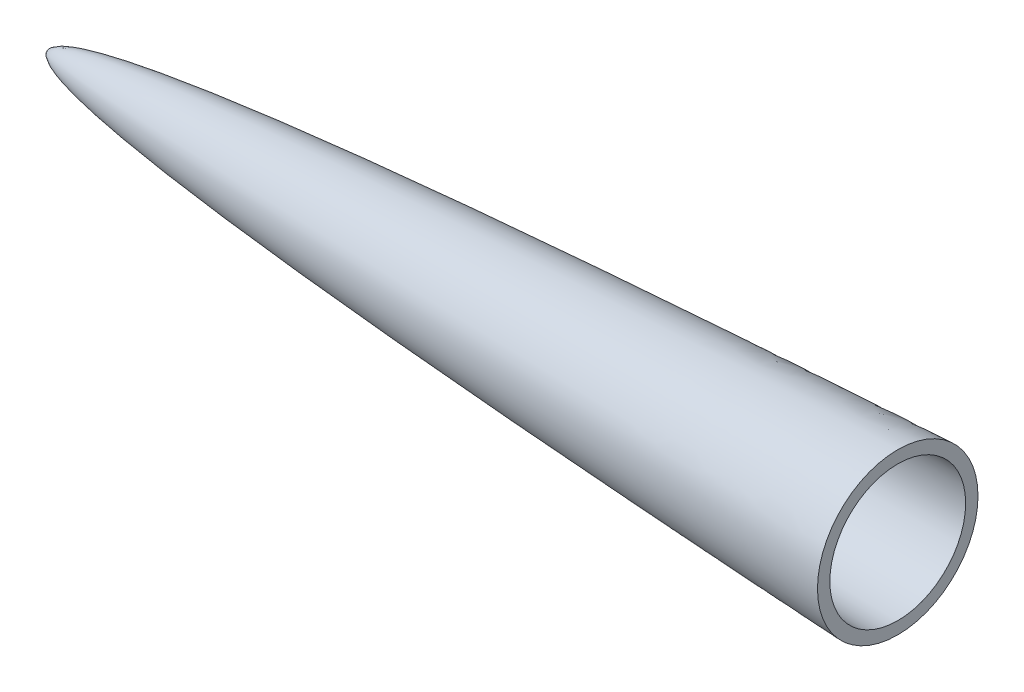
ISO-10303-21;
HEADER;
FILE_DESCRIPTION(('STEP AP214'),'2;1');
FILE_NAME('part.step','',(''),(''),'','','');
FILE_SCHEMA(('AUTOMOTIVE_DESIGN { 1 0 10303 214 1 1 1 1 }'));
ENDSEC;
DATA;
#1=APPLICATION_CONTEXT('core data for automotive mechanical design processes');
#2=APPLICATION_PROTOCOL_DEFINITION('international standard','automotive_design',2000,#1);
#3=PRODUCT_CONTEXT('',#1,'mechanical');
#4=PRODUCT('Part','Part','',(#3));
#5=PRODUCT_RELATED_PRODUCT_CATEGORY('part','',(#4));
#6=PRODUCT_DEFINITION_FORMATION('','',#4);
#7=PRODUCT_DEFINITION_CONTEXT('part definition',#1,'design');
#8=PRODUCT_DEFINITION('design','',#6,#7);
#9=PRODUCT_DEFINITION_SHAPE('','',#8);
#10=(LENGTH_UNIT() NAMED_UNIT(*) SI_UNIT(.MILLI.,.METRE.));
#11=(NAMED_UNIT(*) PLANE_ANGLE_UNIT() SI_UNIT($,.RADIAN.));
#12=(NAMED_UNIT(*) SI_UNIT($,.STERADIAN.) SOLID_ANGLE_UNIT());
#13=UNCERTAINTY_MEASURE_WITH_UNIT(LENGTH_MEASURE(1.E-05),#10,'distance_accuracy_value','');
#14=(GEOMETRIC_REPRESENTATION_CONTEXT(3) GLOBAL_UNCERTAINTY_ASSIGNED_CONTEXT((#13)) GLOBAL_UNIT_ASSIGNED_CONTEXT((#10,
#11,#12)) REPRESENTATION_CONTEXT('',''));
#15=CARTESIAN_POINT('',(0.,0.,0.));
#16=DIRECTION('',(0.,0.,1.));
#17=DIRECTION('',(1.,0.,0.));
#18=AXIS2_PLACEMENT_3D('',#15,#16,#17);
#19=CARTESIAN_POINT('',(537.999999999941,50.7999999999972,0.));
#20=CARTESIAN_POINT('',(533.145109913747,50.5707914345895,0.));
#21=CARTESIAN_POINT('',(525.811294447373,50.222049156183,0.));
#22=CARTESIAN_POINT('',(513.097312965882,49.6133199177748,0.));
#23=CARTESIAN_POINT('',(498.45721349579,48.8986321160422,0.));
#24=CARTESIAN_POINT('',(481.647573764538,48.0703858204924,0.));
#25=CARTESIAN_POINT('',(463.501154617209,47.1562283554697,0.));
#26=CARTESIAN_POINT('',(441.840344629399,46.0429660372756,0.));
#27=CARTESIAN_POINT('',(420.686019175554,44.926815876604,0.));
#28=CARTESIAN_POINT('',(399.23736008743,43.767909876661,0.));
#29=CARTESIAN_POINT('',(377.967980722994,42.5862821447186,0.));
#30=CARTESIAN_POINT('',(356.593090409045,41.3658129460233,0.));
#31=CARTESIAN_POINT('',(335.285381273424,40.111607078148,0.));
#32=CARTESIAN_POINT('',(313.940824565546,38.8151690444315,0.));
#33=CARTESIAN_POINT('',(292.622437860312,37.4753541805813,0.));
#34=CARTESIAN_POINT('',(271.293676053868,36.0854338615715,0.));
#35=CARTESIAN_POINT('',(244.646275848741,34.2794139788725,0.));
#36=CARTESIAN_POINT('',(218.001108130873,32.3689140991301,0.));
#37=CARTESIAN_POINT('',(191.368575072683,30.332808713378,0.));
#38=CARTESIAN_POINT('',(164.746796802987,28.1356290696905,0.));
#39=CARTESIAN_POINT('',(143.46031322691,26.2621939316355,0.));
#40=CARTESIAN_POINT('',(124.84513257381,24.4989894124222,0.));
#41=CARTESIAN_POINT('',(108.900779620021,22.8756908967116,0.));
#42=CARTESIAN_POINT('',(95.6232886134369,21.4305343013527,0.));
#43=CARTESIAN_POINT('',(85.0087554195453,20.2093511122533,0.));
#44=CARTESIAN_POINT('',(72.5037106052807,18.6790945690974,0.));
#45=CARTESIAN_POINT('',(60.39168837642,17.0616006732995,0.));
#46=CARTESIAN_POINT('',(48.6775199067002,15.3308224677582,0.));
#47=CARTESIAN_POINT('',(37.5679386118081,13.4616746665439,0.));
#48=CARTESIAN_POINT('',(28.9430489367147,11.8339105386519,0.));
#49=CARTESIAN_POINT('',(21.6694446602453,10.2492870012652,0.));
#50=CARTESIAN_POINT('',(15.7468920949847,8.74157876281802,0.));
#51=CARTESIAN_POINT('',(10.9678612061917,7.29429584598121,0.));
#52=CARTESIAN_POINT('',(7.71855645559281,6.13659891223,0.));
#53=CARTESIAN_POINT('',(5.11231977335518,5.00654274515038,0.));
#54=CARTESIAN_POINT('',(3.25538083473006,3.98629013762678,0.));
#55=CARTESIAN_POINT('',(2.17246869534447,3.25228473062011,0.));
#56=CARTESIAN_POINT('',(1.48607908376277,2.68834276701202,0.));
#57=CARTESIAN_POINT('',(1.01912531591743,2.22681429230855,0.));
#58=CARTESIAN_POINT('',(0.662642542013483,1.80205196086078,0.));
#59=CARTESIAN_POINT('',(0.366329270557074,1.35872212401963,0.));
#60=CARTESIAN_POINT('',(0.129332644301245,0.862563451425759,0.));
#61=CARTESIAN_POINT('',(0.0242230910694931,0.441465701768415,0.));
#62=CARTESIAN_POINT('',(0.000248537880578506,0.148102193323301,0.));
#63=CARTESIAN_POINT('',(0.,0.,0.));
#64=B_SPLINE_CURVE_WITH_KNOTS('',4,(#19,#20,#21,#22,#23,#24,#25,#26,#27,#28,#29,#30,#31,#32,#33,
#34,#35,#36,#37,#38,#39,#40,#41,#42,#43,#44,#45,#46,#47,#48,#49,#50,#51,#52,#53,#54,#55,#56,#57,
#58,#59,#60,#61,#62,#63),.UNSPECIFIED.,.F.,.F.,(5,1,1,1,1,1,1,1,1,1,1,1,1,1,1,1,1,1,1,1,1,1,1,1,
1,1,1,1,1,1,1,1,1,1,1,1,1,1,1,1,1,5),(0.,0.0357972100645495,0.0536958150968243,
0.0715944201290991,0.107391630216326,0.143188840303553,0.17898605044254,0.214783260581528,
0.250580470729434,0.286377680877339,0.322174890877227,0.357972100877116,0.393769310967931,
0.429566521058746,0.465363731310112,0.501160941561477,0.572755360995865,0.608552571222694,
0.644349781449523,0.68014699052971,0.715944199609898,0.733842804759717,0.751741409909536,
0.769640015059356,0.787538620209175,0.818259380906829,0.833619761255656,0.848980141604482,
0.863023696916377,0.877067252228272,0.883493216546268,0.889919180864264,0.896473331550209,
0.900169679181552,0.902503577870511,0.904096717742301,0.905227601571999,0.906114013311605,
0.906897290613535,0.90780660500585,0.908793021375266,0.909779437744681),.UNSPECIFIED.);
#65=CARTESIAN_POINT('',(2.24265050974282E-11,0.,0.));
#66=DIRECTION('',(-1.,0.,0.));
#67=AXIS1_PLACEMENT('',#65,#66);
#68=SURFACE_OF_REVOLUTION('',#64,#67);
#69=CARTESIAN_POINT('',(2.24265050974282E-11,0.,0.));
#70=VERTEX_POINT('',#69);
#71=VERTEX_LOOP('',#70);
#72=FACE_BOUND('',#71,.T.);
#73=CARTESIAN_POINT('',(537.999999999955,0.,0.));
#74=DIRECTION('',(-1.,0.,0.));
#75=DIRECTION('',(0.,-1.,0.));
#76=AXIS2_PLACEMENT_3D('',#73,#74,#75);
#77=CIRCLE('',#76,50.7999999998519);
#78=CARTESIAN_POINT('',(537.999999999955,-50.7999999998519,0.));
#79=VERTEX_POINT('',#78);
#80=EDGE_CURVE('E40',#79,#79,#77,.T.);
#81=ORIENTED_EDGE('',*,*,#80,.T.);
#82=EDGE_LOOP('',(#81));
#83=FACE_BOUND('',#82,.T.);
#84=ADVANCED_FACE('F32',(#72,#83),#68,.T.);
#85=CARTESIAN_POINT('',(12.7525965030328,0.,0.));
#86=CARTESIAN_POINT('',(10.486364067375,5.19854792790361,0.));
#87=CARTESIAN_POINT('',(59.8559337393032,14.8364650824374,0.));
#88=CARTESIAN_POINT('',(111.223388364284,22.9323154922458,0.));
#89=CARTESIAN_POINT('',(195.289459792533,29.8716158435101,0.));
#90=CARTESIAN_POINT('',(330.149998433861,35.6543661362304,0.));
#91=CARTESIAN_POINT('',(384.601586548292,39.5095329980439,0.));
#92=CARTESIAN_POINT('',(537.999999999955,42.9791831736761,0.));
#93=B_SPLINE_CURVE_WITH_KNOTS('',7,(#85,#86,#87,#88,#89,#90,#91,#92),.UNSPECIFIED.,.F.,.F.,(8,
8),(0.,1.),.UNSPECIFIED.);
#94=CARTESIAN_POINT('',(2.24265050974282E-11,0.,0.));
#95=DIRECTION('',(-1.,0.,0.));
#96=AXIS1_PLACEMENT('',#94,#95);
#97=SURFACE_OF_REVOLUTION('',#93,#96);
#98=CARTESIAN_POINT('',(537.999999999955,0.,0.));
#99=DIRECTION('',(-1.,0.,0.));
#100=DIRECTION('',(0.,-1.,0.));
#101=AXIS2_PLACEMENT_3D('',#98,#99,#100);
#102=CIRCLE('',#101,42.9791831736761);
#103=CARTESIAN_POINT('',(537.999999999955,-42.9791831736761,0.));
#104=VERTEX_POINT('',#103);
#105=EDGE_CURVE('E11',#104,#104,#102,.T.);
#106=ORIENTED_EDGE('',*,*,#105,.F.);
#107=EDGE_LOOP('',(#106));
#108=FACE_BOUND('',#107,.T.);
#109=CARTESIAN_POINT('',(12.7525965030328,0.,0.));
#110=VERTEX_POINT('',#109);
#111=VERTEX_LOOP('',#110);
#112=FACE_BOUND('',#111,.T.);
#113=ADVANCED_FACE('F48',(#108,#112),#97,.T.);
#114=CARTESIAN_POINT('',(537.999999999955,50.7999999998519,0.));
#115=DIRECTION('',(-1.,0.,0.));
#116=DIRECTION('',(0.,-1.,0.));
#117=AXIS2_PLACEMENT_3D('',#114,#115,#116);
#118=PLANE('',#117);
#119=ORIENTED_EDGE('',*,*,#80,.F.);
#120=EDGE_LOOP('',(#119));
#121=FACE_BOUND('',#120,.T.);
#122=ORIENTED_EDGE('',*,*,#105,.T.);
#123=EDGE_LOOP('',(#122));
#124=FACE_BOUND('',#123,.T.);
#125=ADVANCED_FACE('F64',(#121,#124),#118,.F.);
#126=CLOSED_SHELL('',(#84,#113,#125));
#127=MANIFOLD_SOLID_BREP('B2',#126);
#128=ADVANCED_BREP_SHAPE_REPRESENTATION('',(#18,#127),#14);
#129=SHAPE_DEFINITION_REPRESENTATION(#9,#128);
ENDSEC;
END-ISO-10303-21;
